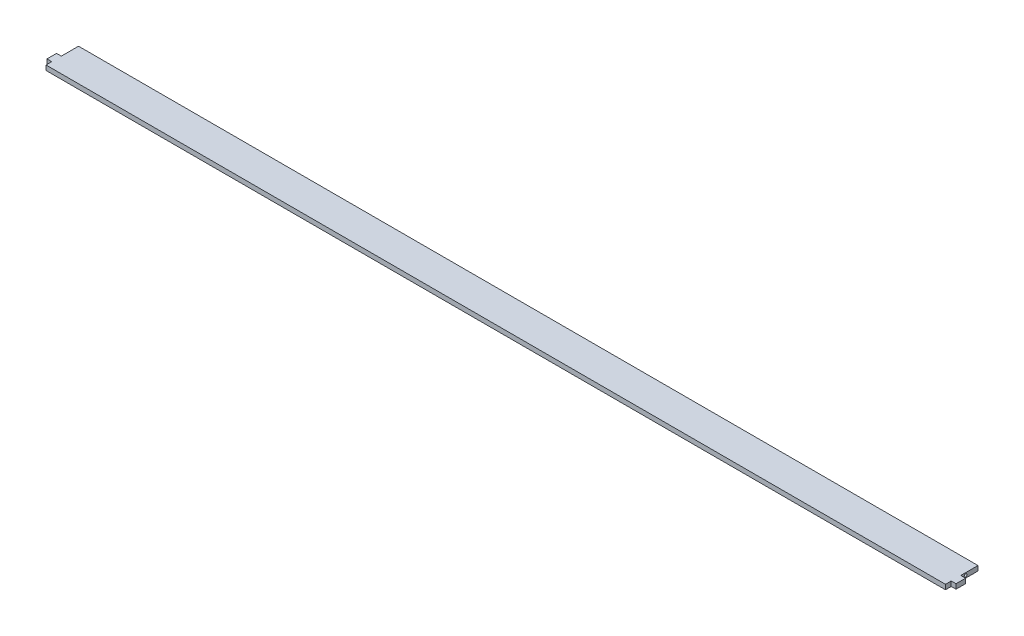
ISO-10303-21;
HEADER;
FILE_DESCRIPTION(('STEP AP214'),'2;1');
FILE_NAME('part.step','',(''),(''),'','','');
FILE_SCHEMA(('AUTOMOTIVE_DESIGN { 1 0 10303 214 1 1 1 1 }'));
ENDSEC;
DATA;
#1=APPLICATION_CONTEXT('core data for automotive mechanical design processes');
#2=APPLICATION_PROTOCOL_DEFINITION('international standard','automotive_design',2000,#1);
#3=PRODUCT_CONTEXT('',#1,'mechanical');
#4=PRODUCT('Part','Part','',(#3));
#5=PRODUCT_RELATED_PRODUCT_CATEGORY('part','',(#4));
#6=PRODUCT_DEFINITION_FORMATION('','',#4);
#7=PRODUCT_DEFINITION_CONTEXT('part definition',#1,'design');
#8=PRODUCT_DEFINITION('design','',#6,#7);
#9=PRODUCT_DEFINITION_SHAPE('','',#8);
#10=(LENGTH_UNIT() NAMED_UNIT(*) SI_UNIT(.MILLI.,.METRE.));
#11=(NAMED_UNIT(*) PLANE_ANGLE_UNIT() SI_UNIT($,.RADIAN.));
#12=(NAMED_UNIT(*) SI_UNIT($,.STERADIAN.) SOLID_ANGLE_UNIT());
#13=UNCERTAINTY_MEASURE_WITH_UNIT(LENGTH_MEASURE(1.E-05),#10,'distance_accuracy_value','');
#14=(GEOMETRIC_REPRESENTATION_CONTEXT(3) GLOBAL_UNCERTAINTY_ASSIGNED_CONTEXT((#13)) GLOBAL_UNIT_ASSIGNED_CONTEXT((#10,
#11,#12)) REPRESENTATION_CONTEXT('',''));
#15=CARTESIAN_POINT('',(0.,0.,0.));
#16=DIRECTION('',(0.,0.,1.));
#17=DIRECTION('',(1.,0.,0.));
#18=AXIS2_PLACEMENT_3D('',#15,#16,#17);
#19=CARTESIAN_POINT('',(298.45,3.175,-11.5343048684803));
#20=DIRECTION('',(-1.,0.,0.));
#21=DIRECTION('',(0.,0.,1.));
#22=AXIS2_PLACEMENT_3D('',#19,#20,#21);
#23=PLANE('',#22);
#24=DIRECTION('',(0.,0.,-1.));
#25=VECTOR('',#24,1.);
#26=CARTESIAN_POINT('',(298.45,0.,-11.5343048684803));
#27=LINE('',#26,#25);
#28=CARTESIAN_POINT('',(298.45,0.,-0.104304868480063));
#29=VERTEX_POINT('',#28);
#30=CARTESIAN_POINT('',(298.45,0.,-11.5343048684803));
#31=VERTEX_POINT('',#30);
#32=EDGE_CURVE('E153',#29,#31,#27,.T.);
#33=ORIENTED_EDGE('',*,*,#32,.T.);
#34=DIRECTION('',(0.,-1.,0.));
#35=VECTOR('',#34,1.);
#36=CARTESIAN_POINT('',(298.45,3.175,-11.5343048684803));
#37=LINE('',#36,#35);
#38=CARTESIAN_POINT('',(298.45,3.175,-11.5343048684803));
#39=VERTEX_POINT('',#38);
#40=EDGE_CURVE('E11',#39,#31,#37,.T.);
#41=ORIENTED_EDGE('',*,*,#40,.F.);
#42=DIRECTION('',(0.,0.,-1.));
#43=VECTOR('',#42,1.);
#44=CARTESIAN_POINT('',(298.45,3.175,-11.5343048684803));
#45=LINE('',#44,#43);
#46=CARTESIAN_POINT('',(298.45,3.175,-0.104304868480063));
#47=VERTEX_POINT('',#46);
#48=EDGE_CURVE('E176',#47,#39,#45,.T.);
#49=ORIENTED_EDGE('',*,*,#48,.F.);
#50=DIRECTION('',(0.,-1.,0.));
#51=VECTOR('',#50,1.);
#52=CARTESIAN_POINT('',(298.45,3.175,-0.104304868480063));
#53=LINE('',#52,#51);
#54=EDGE_CURVE('E149',#47,#29,#53,.T.);
#55=ORIENTED_EDGE('',*,*,#54,.T.);
#56=EDGE_LOOP('',(#33,#41,#49,#55));
#57=FACE_BOUND('',#56,.T.);
#58=CARTESIAN_POINT('',(298.45,1.5875,-3.27930486848006));
#59=DIRECTION('',(-1.,0.,0.));
#60=DIRECTION('',(0.,0.,1.));
#61=AXIS2_PLACEMENT_3D('',#58,#59,#60);
#62=CIRCLE('',#61,0.889000000000003);
#63=CARTESIAN_POINT('',(298.45,1.5875,-2.39030486848006));
#64=VERTEX_POINT('',#63);
#65=EDGE_CURVE('E367',#64,#64,#62,.T.);
#66=ORIENTED_EDGE('',*,*,#65,.T.);
#67=EDGE_LOOP('',(#66));
#68=FACE_BOUND('',#67,.T.);
#69=ADVANCED_FACE('F33',(#57,#68),#23,.F.);
#70=CARTESIAN_POINT('',(298.45,3.175,-11.5343048684803));
#71=DIRECTION('',(0.,0.,1.));
#72=DIRECTION('',(1.,0.,0.));
#73=AXIS2_PLACEMENT_3D('',#70,#71,#72);
#74=PLANE('',#73);
#75=DIRECTION('',(-1.,0.,0.));
#76=VECTOR('',#75,1.);
#77=CARTESIAN_POINT('',(298.45,0.,-11.5343048684803));
#78=LINE('',#77,#76);
#79=CARTESIAN_POINT('',(-298.45,0.,-11.5343048684801));
#80=VERTEX_POINT('',#79);
#81=EDGE_CURVE('E156',#31,#80,#78,.T.);
#82=ORIENTED_EDGE('',*,*,#81,.T.);
#83=DIRECTION('',(0.,-1.,0.));
#84=VECTOR('',#83,1.);
#85=CARTESIAN_POINT('',(-298.45,3.175,-11.5343048684801));
#86=LINE('',#85,#84);
#87=CARTESIAN_POINT('',(-298.45,3.175,-11.5343048684801));
#88=VERTEX_POINT('',#87);
#89=EDGE_CURVE('E41',#88,#80,#86,.T.);
#90=ORIENTED_EDGE('',*,*,#89,.F.);
#91=DIRECTION('',(-1.,0.,0.));
#92=VECTOR('',#91,1.);
#93=CARTESIAN_POINT('',(298.45,3.175,-11.5343048684803));
#94=LINE('',#93,#92);
#95=EDGE_CURVE('E104',#39,#88,#94,.T.);
#96=ORIENTED_EDGE('',*,*,#95,.F.);
#97=ORIENTED_EDGE('',*,*,#40,.T.);
#98=EDGE_LOOP('',(#82,#90,#96,#97));
#99=FACE_BOUND('',#98,.T.);
#100=ADVANCED_FACE('F255',(#99),#74,.F.);
#101=CARTESIAN_POINT('',(-298.45,3.175,-11.5343048684801));
#102=DIRECTION('',(1.,0.,0.));
#103=DIRECTION('',(0.,0.,-1.));
#104=AXIS2_PLACEMENT_3D('',#101,#102,#103);
#105=PLANE('',#104);
#106=CARTESIAN_POINT('',(-298.45,1.5875,-3.27930486848006));
#107=DIRECTION('',(-1.,0.,0.));
#108=DIRECTION('',(0.,0.,1.));
#109=AXIS2_PLACEMENT_3D('',#106,#107,#108);
#110=CIRCLE('',#109,0.889000000000003);
#111=CARTESIAN_POINT('',(-298.45,1.5875,-2.39030486848006));
#112=VERTEX_POINT('',#111);
#113=EDGE_CURVE('E366',#112,#112,#110,.T.);
#114=ORIENTED_EDGE('',*,*,#113,.F.);
#115=EDGE_LOOP('',(#114));
#116=FACE_BOUND('',#115,.T.);
#117=DIRECTION('',(0.,0.,1.));
#118=VECTOR('',#117,1.);
#119=CARTESIAN_POINT('',(-298.45,0.,-11.5343048684801));
#120=LINE('',#119,#118);
#121=CARTESIAN_POINT('',(-298.45,0.,-0.104304868480063));
#122=VERTEX_POINT('',#121);
#123=EDGE_CURVE('E159',#80,#122,#120,.T.);
#124=ORIENTED_EDGE('',*,*,#123,.T.);
#125=DIRECTION('',(0.,-1.,0.));
#126=VECTOR('',#125,1.);
#127=CARTESIAN_POINT('',(-298.45,3.175,-0.104304868480063));
#128=LINE('',#127,#126);
#129=CARTESIAN_POINT('',(-298.45,3.175,-0.104304868480063));
#130=VERTEX_POINT('',#129);
#131=EDGE_CURVE('E195',#130,#122,#128,.T.);
#132=ORIENTED_EDGE('',*,*,#131,.F.);
#133=DIRECTION('',(0.,0.,1.));
#134=VECTOR('',#133,1.);
#135=CARTESIAN_POINT('',(-298.45,3.175,-11.5343048684801));
#136=LINE('',#135,#134);
#137=EDGE_CURVE('E203',#88,#130,#136,.T.);
#138=ORIENTED_EDGE('',*,*,#137,.F.);
#139=ORIENTED_EDGE('',*,*,#89,.T.);
#140=EDGE_LOOP('',(#124,#132,#138,#139));
#141=FACE_BOUND('',#140,.T.);
#142=ADVANCED_FACE('F201',(#116,#141),#105,.F.);
#143=CARTESIAN_POINT('',(-298.45,3.175,-0.104304868480063));
#144=DIRECTION('',(0.,0.,1.));
#145=DIRECTION('',(1.,0.,0.));
#146=AXIS2_PLACEMENT_3D('',#143,#144,#145);
#147=PLANE('',#146);
#148=DIRECTION('',(-1.,0.,0.));
#149=VECTOR('',#148,1.);
#150=CARTESIAN_POINT('',(-298.45,0.,-0.104304868480063));
#151=LINE('',#150,#149);
#152=CARTESIAN_POINT('',(-301.625,0.,-0.104304868480063));
#153=VERTEX_POINT('',#152);
#154=EDGE_CURVE('E161',#122,#153,#151,.T.);
#155=ORIENTED_EDGE('',*,*,#154,.T.);
#156=DIRECTION('',(0.,-1.,0.));
#157=VECTOR('',#156,1.);
#158=CARTESIAN_POINT('',(-301.625,3.175,-0.104304868480063));
#159=LINE('',#158,#157);
#160=CARTESIAN_POINT('',(-301.625,3.175,-0.104304868480063));
#161=VERTEX_POINT('',#160);
#162=EDGE_CURVE('E192',#161,#153,#159,.T.);
#163=ORIENTED_EDGE('',*,*,#162,.F.);
#164=DIRECTION('',(-1.,0.,0.));
#165=VECTOR('',#164,1.);
#166=CARTESIAN_POINT('',(-298.45,3.175,-0.104304868480063));
#167=LINE('',#166,#165);
#168=EDGE_CURVE('E221',#130,#161,#167,.T.);
#169=ORIENTED_EDGE('',*,*,#168,.F.);
#170=ORIENTED_EDGE('',*,*,#131,.T.);
#171=EDGE_LOOP('',(#155,#163,#169,#170));
#172=FACE_BOUND('',#171,.T.);
#173=ADVANCED_FACE('F212',(#172),#147,.F.);
#174=CARTESIAN_POINT('',(-301.625,3.175,-0.104304868480063));
#175=DIRECTION('',(1.,0.,0.));
#176=DIRECTION('',(0.,0.,-1.));
#177=AXIS2_PLACEMENT_3D('',#174,#175,#176);
#178=PLANE('',#177);
#179=DIRECTION('',(0.,0.,1.));
#180=VECTOR('',#179,1.);
#181=CARTESIAN_POINT('',(-301.625,0.,-0.104304868480063));
#182=LINE('',#181,#180);
#183=CARTESIAN_POINT('',(-301.625,0.,6.24569513151994));
#184=VERTEX_POINT('',#183);
#185=EDGE_CURVE('E163',#153,#184,#182,.T.);
#186=ORIENTED_EDGE('',*,*,#185,.T.);
#187=DIRECTION('',(0.,-1.,0.));
#188=VECTOR('',#187,1.);
#189=CARTESIAN_POINT('',(-301.625,3.175,6.24569513151994));
#190=LINE('',#189,#188);
#191=CARTESIAN_POINT('',(-301.625,3.175,6.24569513151994));
#192=VERTEX_POINT('',#191);
#193=EDGE_CURVE('E189',#192,#184,#190,.T.);
#194=ORIENTED_EDGE('',*,*,#193,.F.);
#195=DIRECTION('',(0.,0.,1.));
#196=VECTOR('',#195,1.);
#197=CARTESIAN_POINT('',(-301.625,3.175,-0.104304868480063));
#198=LINE('',#197,#196);
#199=EDGE_CURVE('E218',#161,#192,#198,.T.);
#200=ORIENTED_EDGE('',*,*,#199,.F.);
#201=ORIENTED_EDGE('',*,*,#162,.T.);
#202=EDGE_LOOP('',(#186,#194,#200,#201));
#203=FACE_BOUND('',#202,.T.);
#204=ADVANCED_FACE('F216',(#203),#178,.F.);
#205=CARTESIAN_POINT('',(-298.45,3.175,6.24569513151994));
#206=DIRECTION('',(0.,0.,-1.));
#207=DIRECTION('',(-1.,0.,0.));
#208=AXIS2_PLACEMENT_3D('',#205,#206,#207);
#209=PLANE('',#208);
#210=DIRECTION('',(1.,0.,0.));
#211=VECTOR('',#210,1.);
#212=CARTESIAN_POINT('',(-298.45,0.,6.24569513151994));
#213=LINE('',#212,#211);
#214=CARTESIAN_POINT('',(-298.45,0.,6.24569513151994));
#215=VERTEX_POINT('',#214);
#216=EDGE_CURVE('E165',#184,#215,#213,.T.);
#217=ORIENTED_EDGE('',*,*,#216,.T.);
#218=DIRECTION('',(0.,-1.,0.));
#219=VECTOR('',#218,1.);
#220=CARTESIAN_POINT('',(-298.45,3.175,6.24569513151994));
#221=LINE('',#220,#219);
#222=CARTESIAN_POINT('',(-298.45,3.175,6.24569513151994));
#223=VERTEX_POINT('',#222);
#224=EDGE_CURVE('E186',#223,#215,#221,.T.);
#225=ORIENTED_EDGE('',*,*,#224,.F.);
#226=DIRECTION('',(1.,0.,0.));
#227=VECTOR('',#226,1.);
#228=CARTESIAN_POINT('',(-298.45,3.175,6.24569513151994));
#229=LINE('',#228,#227);
#230=EDGE_CURVE('E220',#192,#223,#229,.T.);
#231=ORIENTED_EDGE('',*,*,#230,.F.);
#232=ORIENTED_EDGE('',*,*,#193,.T.);
#233=EDGE_LOOP('',(#217,#225,#231,#232));
#234=FACE_BOUND('',#233,.T.);
#235=ADVANCED_FACE('F269',(#234),#209,.F.);
#236=CARTESIAN_POINT('',(-298.45,3.175,6.24569513151994));
#237=DIRECTION('',(1.,0.,0.));
#238=DIRECTION('',(0.,0.,-1.));
#239=AXIS2_PLACEMENT_3D('',#236,#237,#238);
#240=PLANE('',#239);
#241=DIRECTION('',(0.,0.,1.));
#242=VECTOR('',#241,1.);
#243=CARTESIAN_POINT('',(-298.45,0.,6.24569513151994));
#244=LINE('',#243,#242);
#245=CARTESIAN_POINT('',(-298.45,0.,10.0556951315198));
#246=VERTEX_POINT('',#245);
#247=EDGE_CURVE('E167',#215,#246,#244,.T.);
#248=ORIENTED_EDGE('',*,*,#247,.T.);
#249=DIRECTION('',(0.,-1.,0.));
#250=VECTOR('',#249,1.);
#251=CARTESIAN_POINT('',(-298.45,3.175,10.0556951315198));
#252=LINE('',#251,#250);
#253=CARTESIAN_POINT('',(-298.45,3.175,10.0556951315198));
#254=VERTEX_POINT('',#253);
#255=EDGE_CURVE('E183',#254,#246,#252,.T.);
#256=ORIENTED_EDGE('',*,*,#255,.F.);
#257=DIRECTION('',(0.,0.,1.));
#258=VECTOR('',#257,1.);
#259=CARTESIAN_POINT('',(-298.45,3.175,6.24569513151994));
#260=LINE('',#259,#258);
#261=EDGE_CURVE('E223',#223,#254,#260,.T.);
#262=ORIENTED_EDGE('',*,*,#261,.F.);
#263=ORIENTED_EDGE('',*,*,#224,.T.);
#264=EDGE_LOOP('',(#248,#256,#262,#263));
#265=FACE_BOUND('',#264,.T.);
#266=ADVANCED_FACE('F272',(#265),#240,.F.);
#267=CARTESIAN_POINT('',(-298.45,3.175,10.0556951315198));
#268=DIRECTION('',(0.,0.,-1.));
#269=DIRECTION('',(-1.,0.,0.));
#270=AXIS2_PLACEMENT_3D('',#267,#268,#269);
#271=PLANE('',#270);
#272=DIRECTION('',(1.,0.,0.));
#273=VECTOR('',#272,1.);
#274=CARTESIAN_POINT('',(-298.45,0.,10.0556951315198));
#275=LINE('',#274,#273);
#276=CARTESIAN_POINT('',(298.45,0.,10.0556951315196));
#277=VERTEX_POINT('',#276);
#278=EDGE_CURVE('E169',#246,#277,#275,.T.);
#279=ORIENTED_EDGE('',*,*,#278,.T.);
#280=DIRECTION('',(0.,-1.,0.));
#281=VECTOR('',#280,1.);
#282=CARTESIAN_POINT('',(298.45,3.175,10.0556951315196));
#283=LINE('',#282,#281);
#284=CARTESIAN_POINT('',(298.45,3.175,10.0556951315196));
#285=VERTEX_POINT('',#284);
#286=EDGE_CURVE('E180',#285,#277,#283,.T.);
#287=ORIENTED_EDGE('',*,*,#286,.F.);
#288=DIRECTION('',(1.,0.,0.));
#289=VECTOR('',#288,1.);
#290=CARTESIAN_POINT('',(-298.45,3.175,10.0556951315198));
#291=LINE('',#290,#289);
#292=EDGE_CURVE('E229',#254,#285,#291,.T.);
#293=ORIENTED_EDGE('',*,*,#292,.F.);
#294=ORIENTED_EDGE('',*,*,#255,.T.);
#295=EDGE_LOOP('',(#279,#287,#293,#294));
#296=FACE_BOUND('',#295,.T.);
#297=ADVANCED_FACE('F235',(#296),#271,.F.);
#298=CARTESIAN_POINT('',(298.45,3.175,6.24569513151994));
#299=DIRECTION('',(-1.,0.,0.));
#300=DIRECTION('',(0.,0.,1.));
#301=AXIS2_PLACEMENT_3D('',#298,#299,#300);
#302=PLANE('',#301);
#303=DIRECTION('',(0.,0.,-1.));
#304=VECTOR('',#303,1.);
#305=CARTESIAN_POINT('',(298.45,0.,6.24569513151994));
#306=LINE('',#305,#304);
#307=CARTESIAN_POINT('',(298.45,0.,6.24569513151994));
#308=VERTEX_POINT('',#307);
#309=EDGE_CURVE('E171',#277,#308,#306,.T.);
#310=ORIENTED_EDGE('',*,*,#309,.T.);
#311=DIRECTION('',(0.,-1.,0.));
#312=VECTOR('',#311,1.);
#313=CARTESIAN_POINT('',(298.45,3.175,6.24569513151994));
#314=LINE('',#313,#312);
#315=CARTESIAN_POINT('',(298.45,3.175,6.24569513151994));
#316=VERTEX_POINT('',#315);
#317=EDGE_CURVE('E144',#316,#308,#314,.T.);
#318=ORIENTED_EDGE('',*,*,#317,.F.);
#319=DIRECTION('',(0.,0.,-1.));
#320=VECTOR('',#319,1.);
#321=CARTESIAN_POINT('',(298.45,3.175,6.24569513151994));
#322=LINE('',#321,#320);
#323=EDGE_CURVE('E135',#285,#316,#322,.T.);
#324=ORIENTED_EDGE('',*,*,#323,.F.);
#325=ORIENTED_EDGE('',*,*,#286,.T.);
#326=EDGE_LOOP('',(#310,#318,#324,#325));
#327=FACE_BOUND('',#326,.T.);
#328=ADVANCED_FACE('F239',(#327),#302,.F.);
#329=CARTESIAN_POINT('',(298.45,3.175,6.24569513151994));
#330=DIRECTION('',(0.,0.,-1.));
#331=DIRECTION('',(-1.,0.,0.));
#332=AXIS2_PLACEMENT_3D('',#329,#330,#331);
#333=PLANE('',#332);
#334=DIRECTION('',(1.,0.,0.));
#335=VECTOR('',#334,1.);
#336=CARTESIAN_POINT('',(298.45,0.,6.24569513151994));
#337=LINE('',#336,#335);
#338=CARTESIAN_POINT('',(301.625,0.,6.24569513151994));
#339=VERTEX_POINT('',#338);
#340=EDGE_CURVE('E143',#308,#339,#337,.T.);
#341=ORIENTED_EDGE('',*,*,#340,.T.);
#342=DIRECTION('',(0.,-1.,0.));
#343=VECTOR('',#342,1.);
#344=CARTESIAN_POINT('',(301.625,3.175,6.24569513151994));
#345=LINE('',#344,#343);
#346=CARTESIAN_POINT('',(301.625,3.175,6.24569513151994));
#347=VERTEX_POINT('',#346);
#348=EDGE_CURVE('E140',#347,#339,#345,.T.);
#349=ORIENTED_EDGE('',*,*,#348,.F.);
#350=DIRECTION('',(1.,0.,0.));
#351=VECTOR('',#350,1.);
#352=CARTESIAN_POINT('',(298.45,3.175,6.24569513151994));
#353=LINE('',#352,#351);
#354=EDGE_CURVE('E129',#316,#347,#353,.T.);
#355=ORIENTED_EDGE('',*,*,#354,.F.);
#356=ORIENTED_EDGE('',*,*,#317,.T.);
#357=EDGE_LOOP('',(#341,#349,#355,#356));
#358=FACE_BOUND('',#357,.T.);
#359=ADVANCED_FACE('F141',(#358),#333,.F.);
#360=CARTESIAN_POINT('',(301.625,3.175,-0.104304868480063));
#361=DIRECTION('',(-1.,0.,0.));
#362=DIRECTION('',(0.,0.,1.));
#363=AXIS2_PLACEMENT_3D('',#360,#361,#362);
#364=PLANE('',#363);
#365=DIRECTION('',(0.,0.,-1.));
#366=VECTOR('',#365,1.);
#367=CARTESIAN_POINT('',(301.625,0.,-0.104304868480063));
#368=LINE('',#367,#366);
#369=CARTESIAN_POINT('',(301.625,0.,-0.104304868480063));
#370=VERTEX_POINT('',#369);
#371=EDGE_CURVE('E90',#339,#370,#368,.T.);
#372=ORIENTED_EDGE('',*,*,#371,.T.);
#373=DIRECTION('',(0.,-1.,0.));
#374=VECTOR('',#373,1.);
#375=CARTESIAN_POINT('',(301.625,3.175,-0.104304868480063));
#376=LINE('',#375,#374);
#377=CARTESIAN_POINT('',(301.625,3.175,-0.104304868480063));
#378=VERTEX_POINT('',#377);
#379=EDGE_CURVE('E145',#378,#370,#376,.T.);
#380=ORIENTED_EDGE('',*,*,#379,.F.);
#381=DIRECTION('',(0.,0.,-1.));
#382=VECTOR('',#381,1.);
#383=CARTESIAN_POINT('',(301.625,3.175,-0.104304868480063));
#384=LINE('',#383,#382);
#385=EDGE_CURVE('E133',#347,#378,#384,.T.);
#386=ORIENTED_EDGE('',*,*,#385,.F.);
#387=ORIENTED_EDGE('',*,*,#348,.T.);
#388=EDGE_LOOP('',(#372,#380,#386,#387));
#389=FACE_BOUND('',#388,.T.);
#390=ADVANCED_FACE('F147',(#389),#364,.F.);
#391=CARTESIAN_POINT('',(298.45,3.175,-0.104304868480063));
#392=DIRECTION('',(0.,0.,1.));
#393=DIRECTION('',(1.,0.,0.));
#394=AXIS2_PLACEMENT_3D('',#391,#392,#393);
#395=PLANE('',#394);
#396=DIRECTION('',(-1.,0.,0.));
#397=VECTOR('',#396,1.);
#398=CARTESIAN_POINT('',(298.45,0.,-0.104304868480063));
#399=LINE('',#398,#397);
#400=EDGE_CURVE('E96',#370,#29,#399,.T.);
#401=ORIENTED_EDGE('',*,*,#400,.T.);
#402=ORIENTED_EDGE('',*,*,#54,.F.);
#403=DIRECTION('',(-1.,0.,0.));
#404=VECTOR('',#403,1.);
#405=CARTESIAN_POINT('',(298.45,3.175,-0.104304868480063));
#406=LINE('',#405,#404);
#407=EDGE_CURVE('E49',#378,#47,#406,.T.);
#408=ORIENTED_EDGE('',*,*,#407,.F.);
#409=ORIENTED_EDGE('',*,*,#379,.T.);
#410=EDGE_LOOP('',(#401,#402,#408,#409));
#411=FACE_BOUND('',#410,.T.);
#412=ADVANCED_FACE('F244',(#411),#395,.F.);
#413=CARTESIAN_POINT('',(298.45,3.175,-0.104304868480063));
#414=DIRECTION('',(0.,1.,0.));
#415=DIRECTION('',(0.,0.,1.));
#416=AXIS2_PLACEMENT_3D('',#413,#414,#415);
#417=PLANE('',#416);
#418=ORIENTED_EDGE('',*,*,#48,.T.);
#419=ORIENTED_EDGE('',*,*,#95,.T.);
#420=ORIENTED_EDGE('',*,*,#137,.T.);
#421=ORIENTED_EDGE('',*,*,#168,.T.);
#422=ORIENTED_EDGE('',*,*,#199,.T.);
#423=ORIENTED_EDGE('',*,*,#230,.T.);
#424=ORIENTED_EDGE('',*,*,#261,.T.);
#425=ORIENTED_EDGE('',*,*,#292,.T.);
#426=ORIENTED_EDGE('',*,*,#323,.T.);
#427=ORIENTED_EDGE('',*,*,#354,.T.);
#428=ORIENTED_EDGE('',*,*,#385,.T.);
#429=ORIENTED_EDGE('',*,*,#407,.T.);
#430=EDGE_LOOP('',(#418,#419,#420,#421,#422,#423,#424,#425,#426,#427,#428,#429));
#431=FACE_BOUND('',#430,.T.);
#432=ADVANCED_FACE('F131',(#431),#417,.T.);
#433=CARTESIAN_POINT('',(298.45,0.,-0.104304868480063));
#434=DIRECTION('',(0.,1.,0.));
#435=DIRECTION('',(0.,0.,1.));
#436=AXIS2_PLACEMENT_3D('',#433,#434,#435);
#437=PLANE('',#436);
#438=ORIENTED_EDGE('',*,*,#32,.F.);
#439=ORIENTED_EDGE('',*,*,#400,.F.);
#440=ORIENTED_EDGE('',*,*,#371,.F.);
#441=ORIENTED_EDGE('',*,*,#340,.F.);
#442=ORIENTED_EDGE('',*,*,#309,.F.);
#443=ORIENTED_EDGE('',*,*,#278,.F.);
#444=ORIENTED_EDGE('',*,*,#247,.F.);
#445=ORIENTED_EDGE('',*,*,#216,.F.);
#446=ORIENTED_EDGE('',*,*,#185,.F.);
#447=ORIENTED_EDGE('',*,*,#154,.F.);
#448=ORIENTED_EDGE('',*,*,#123,.F.);
#449=ORIENTED_EDGE('',*,*,#81,.F.);
#450=EDGE_LOOP('',(#438,#439,#440,#441,#442,#443,#444,#445,#446,#447,#448,#449));
#451=FACE_BOUND('',#450,.T.);
#452=ADVANCED_FACE('F207',(#451),#437,.F.);
#453=CARTESIAN_POINT('',(-292.1,1.5875,-3.27930486848006));
#454=DIRECTION('',(-1.,0.,0.));
#455=DIRECTION('',(0.,0.,1.));
#456=AXIS2_PLACEMENT_3D('',#453,#454,#455);
#457=CYLINDRICAL_SURFACE('',#456,0.889000000000003);
#458=CARTESIAN_POINT('',(-292.1,1.5875,-3.27930486848006));
#459=DIRECTION('',(-1.,0.,0.));
#460=DIRECTION('',(0.,0.,1.));
#461=AXIS2_PLACEMENT_3D('',#458,#459,#460);
#462=CIRCLE('',#461,0.889000000000003);
#463=CARTESIAN_POINT('',(-292.1,1.5875,-2.39030486848006));
#464=VERTEX_POINT('',#463);
#465=EDGE_CURVE('E157',#464,#464,#462,.T.);
#466=ORIENTED_EDGE('',*,*,#465,.F.);
#467=EDGE_LOOP('',(#466));
#468=FACE_BOUND('',#467,.T.);
#469=ORIENTED_EDGE('',*,*,#113,.T.);
#470=EDGE_LOOP('',(#469));
#471=FACE_BOUND('',#470,.T.);
#472=ADVANCED_FACE('F309',(#468,#471),#457,.F.);
#473=CARTESIAN_POINT('',(-292.1,1.5875,-3.27930486848006));
#474=DIRECTION('',(-1.,0.,0.));
#475=DIRECTION('',(0.,0.,1.));
#476=AXIS2_PLACEMENT_3D('',#473,#474,#475);
#477=PLANE('',#476);
#478=ORIENTED_EDGE('',*,*,#465,.T.);
#479=EDGE_LOOP('',(#478));
#480=FACE_BOUND('',#479,.T.);
#481=ADVANCED_FACE('F325',(#480),#477,.T.);
#482=CARTESIAN_POINT('',(292.1,1.5875,-3.27930486848006));
#483=DIRECTION('',(1.,0.,0.));
#484=DIRECTION('',(0.,0.,-1.));
#485=AXIS2_PLACEMENT_3D('',#482,#483,#484);
#486=CYLINDRICAL_SURFACE('',#485,0.889000000000003);
#487=CARTESIAN_POINT('',(292.1,1.5875,-3.27930486848006));
#488=DIRECTION('',(-1.,0.,0.));
#489=DIRECTION('',(0.,0.,1.));
#490=AXIS2_PLACEMENT_3D('',#487,#488,#489);
#491=CIRCLE('',#490,0.889000000000003);
#492=CARTESIAN_POINT('',(292.1,1.5875,-2.39030486848006));
#493=VERTEX_POINT('',#492);
#494=EDGE_CURVE('E365',#493,#493,#491,.T.);
#495=ORIENTED_EDGE('',*,*,#494,.T.);
#496=EDGE_LOOP('',(#495));
#497=FACE_BOUND('',#496,.T.);
#498=ORIENTED_EDGE('',*,*,#65,.F.);
#499=EDGE_LOOP('',(#498));
#500=FACE_BOUND('',#499,.T.);
#501=ADVANCED_FACE('F334',(#497,#500),#486,.F.);
#502=CARTESIAN_POINT('',(292.1,1.5875,-3.27930486848006));
#503=DIRECTION('',(1.,0.,0.));
#504=DIRECTION('',(0.,0.,1.));
#505=AXIS2_PLACEMENT_3D('',#502,#503,#504);
#506=PLANE('',#505);
#507=ORIENTED_EDGE('',*,*,#494,.F.);
#508=EDGE_LOOP('',(#507));
#509=FACE_BOUND('',#508,.T.);
#510=ADVANCED_FACE('F349',(#509),#506,.T.);
#511=CLOSED_SHELL('',(#69,#100,#142,#173,#204,#235,#266,#297,#328,#359,#390,#412,#432,#452,#472,
#481,#501,#510));
#512=MANIFOLD_SOLID_BREP('B2',#511);
#513=ADVANCED_BREP_SHAPE_REPRESENTATION('',(#18,#512),#14);
#514=SHAPE_DEFINITION_REPRESENTATION(#9,#513);
ENDSEC;
END-ISO-10303-21;
